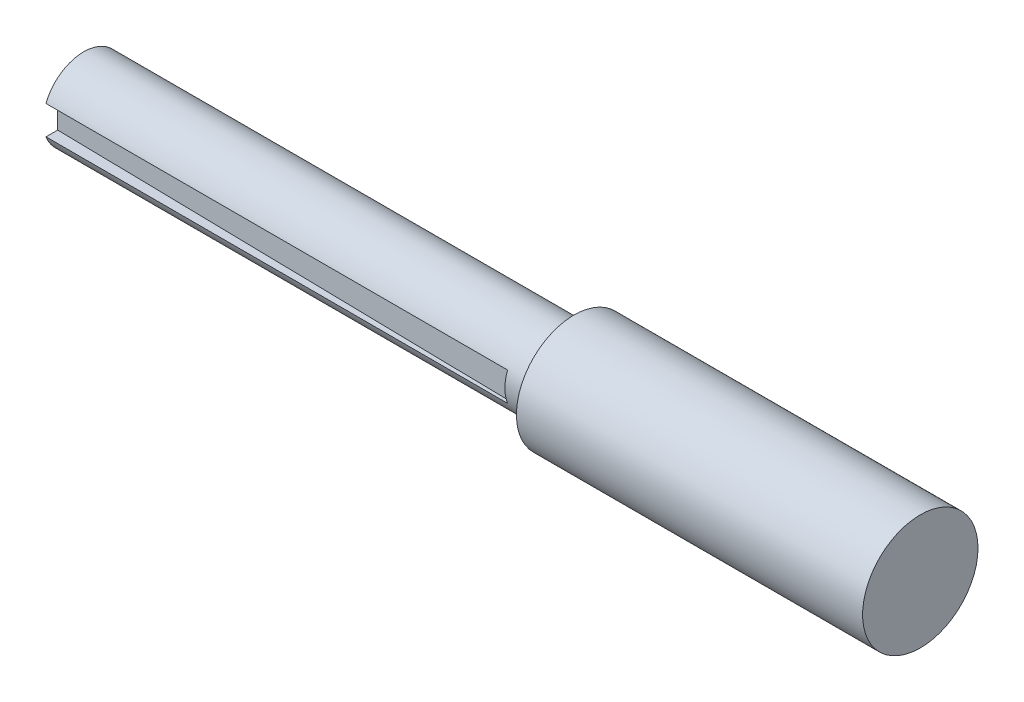
ISO-10303-21;
HEADER;
FILE_DESCRIPTION(('STEP AP214'),'2;1');
FILE_NAME('part.step','',(''),(''),'','','');
FILE_SCHEMA(('AUTOMOTIVE_DESIGN { 1 0 10303 214 1 1 1 1 }'));
ENDSEC;
DATA;
#1=APPLICATION_CONTEXT('core data for automotive mechanical design processes');
#2=APPLICATION_PROTOCOL_DEFINITION('international standard','automotive_design',2000,#1);
#3=PRODUCT_CONTEXT('',#1,'mechanical');
#4=PRODUCT('Part','Part','',(#3));
#5=PRODUCT_RELATED_PRODUCT_CATEGORY('part','',(#4));
#6=PRODUCT_DEFINITION_FORMATION('','',#4);
#7=PRODUCT_DEFINITION_CONTEXT('part definition',#1,'design');
#8=PRODUCT_DEFINITION('design','',#6,#7);
#9=PRODUCT_DEFINITION_SHAPE('','',#8);
#10=(LENGTH_UNIT() NAMED_UNIT(*) SI_UNIT(.MILLI.,.METRE.));
#11=(NAMED_UNIT(*) PLANE_ANGLE_UNIT() SI_UNIT($,.RADIAN.));
#12=(NAMED_UNIT(*) SI_UNIT($,.STERADIAN.) SOLID_ANGLE_UNIT());
#13=UNCERTAINTY_MEASURE_WITH_UNIT(LENGTH_MEASURE(1.E-05),#10,'distance_accuracy_value','');
#14=(GEOMETRIC_REPRESENTATION_CONTEXT(3) GLOBAL_UNCERTAINTY_ASSIGNED_CONTEXT((#13)) GLOBAL_UNIT_ASSIGNED_CONTEXT((#10,
#11,#12)) REPRESENTATION_CONTEXT('',''));
#15=CARTESIAN_POINT('',(0.,0.,0.));
#16=DIRECTION('',(0.,0.,1.));
#17=DIRECTION('',(1.,0.,0.));
#18=AXIS2_PLACEMENT_3D('',#15,#16,#17);
#19=CARTESIAN_POINT('',(-145.,0.,0.));
#20=DIRECTION('',(1.,0.,0.));
#21=DIRECTION('',(0.,0.,-1.));
#22=AXIS2_PLACEMENT_3D('',#19,#20,#21);
#23=CYLINDRICAL_SURFACE('',#22,10.);
#24=CARTESIAN_POINT('',(-60.,0.,0.));
#25=DIRECTION('',(1.,0.,0.));
#26=DIRECTION('',(0.,0.,-1.));
#27=AXIS2_PLACEMENT_3D('',#24,#25,#26);
#28=CIRCLE('',#27,10.);
#29=CARTESIAN_POINT('',(-60.,0.,-10.));
#30=VERTEX_POINT('',#29);
#31=EDGE_CURVE('E154',#30,#30,#28,.T.);
#32=ORIENTED_EDGE('',*,*,#31,.T.);
#33=EDGE_LOOP('',(#32));
#34=FACE_BOUND('',#33,.T.);
#35=CARTESIAN_POINT('',(0.,0.,0.));
#36=DIRECTION('',(1.,0.,0.));
#37=DIRECTION('',(0.,0.,-1.));
#38=AXIS2_PLACEMENT_3D('',#35,#36,#37);
#39=CIRCLE('',#38,10.);
#40=CARTESIAN_POINT('',(0.,0.,-10.));
#41=VERTEX_POINT('',#40);
#42=EDGE_CURVE('E166',#41,#41,#39,.T.);
#43=ORIENTED_EDGE('',*,*,#42,.F.);
#44=EDGE_LOOP('',(#43));
#45=FACE_BOUND('',#44,.T.);
#46=ADVANCED_FACE('F97',(#34,#45),#23,.T.);
#47=CARTESIAN_POINT('',(0.,0.,0.));
#48=DIRECTION('',(1.,0.,0.));
#49=DIRECTION('',(0.,0.,-1.));
#50=AXIS2_PLACEMENT_3D('',#47,#48,#49);
#51=PLANE('',#50);
#52=ORIENTED_EDGE('',*,*,#42,.T.);
#53=EDGE_LOOP('',(#52));
#54=FACE_BOUND('',#53,.T.);
#55=ADVANCED_FACE('F262',(#54),#51,.T.);
#56=CARTESIAN_POINT('',(-157.,0.,0.));
#57=DIRECTION('',(1.,0.,0.));
#58=DIRECTION('',(0.,0.,-1.));
#59=AXIS2_PLACEMENT_3D('',#56,#57,#58);
#60=CYLINDRICAL_SURFACE('',#59,7.);
#61=DIRECTION('',(1.,0.,0.));
#62=VECTOR('',#61,1.);
#63=CARTESIAN_POINT('',(-157.,2.5,6.53834841531101));
#64=LINE('',#63,#62);
#65=CARTESIAN_POINT('',(-65.,2.5,6.53834841531101));
#66=VERTEX_POINT('',#65);
#67=CARTESIAN_POINT('',(-145.,2.5,6.53834841531101));
#68=VERTEX_POINT('',#67);
#69=EDGE_CURVE('E147',#66,#68,#64,.F.);
#70=ORIENTED_EDGE('',*,*,#69,.F.);
#71=CARTESIAN_POINT('',(-65.,0.,0.));
#72=DIRECTION('',(-1.,0.,0.));
#73=DIRECTION('',(0.,0.,1.));
#74=AXIS2_PLACEMENT_3D('',#71,#72,#73);
#75=CIRCLE('',#74,7.);
#76=CARTESIAN_POINT('',(-65.,-2.5,6.53834841531101));
#77=VERTEX_POINT('',#76);
#78=EDGE_CURVE('E13',#66,#77,#75,.F.);
#79=ORIENTED_EDGE('',*,*,#78,.T.);
#80=DIRECTION('',(1.,0.,0.));
#81=VECTOR('',#80,1.);
#82=CARTESIAN_POINT('',(-157.,-2.5,6.53834841531101));
#83=LINE('',#82,#81);
#84=CARTESIAN_POINT('',(-145.,-2.5,6.53834841531101));
#85=VERTEX_POINT('',#84);
#86=EDGE_CURVE('E144',#85,#77,#83,.T.);
#87=ORIENTED_EDGE('',*,*,#86,.F.);
#88=CARTESIAN_POINT('',(-145.,0.,0.));
#89=DIRECTION('',(1.,0.,0.));
#90=DIRECTION('',(0.,0.,-1.));
#91=AXIS2_PLACEMENT_3D('',#88,#89,#90);
#92=CIRCLE('',#91,7.);
#93=EDGE_CURVE('E160',#85,#68,#92,.T.);
#94=ORIENTED_EDGE('',*,*,#93,.T.);
#95=EDGE_LOOP('',(#70,#79,#87,#94));
#96=FACE_BOUND('',#95,.T.);
#97=CARTESIAN_POINT('',(-61.,0.,0.));
#98=DIRECTION('',(1.,0.,0.));
#99=DIRECTION('',(0.,0.,-1.));
#100=AXIS2_PLACEMENT_3D('',#97,#98,#99);
#101=CIRCLE('',#100,7.);
#102=CARTESIAN_POINT('',(-61.,0.,-7.));
#103=VERTEX_POINT('',#102);
#104=EDGE_CURVE('E162',#103,#103,#101,.F.);
#105=ORIENTED_EDGE('',*,*,#104,.T.);
#106=EDGE_LOOP('',(#105));
#107=FACE_BOUND('',#106,.T.);
#108=ADVANCED_FACE('F163',(#96,#107),#60,.T.);
#109=CARTESIAN_POINT('',(-60.,0.,0.));
#110=DIRECTION('',(1.,0.,0.));
#111=DIRECTION('',(0.,0.,-1.));
#112=AXIS2_PLACEMENT_3D('',#109,#110,#111);
#113=PLANE('',#112);
#114=CARTESIAN_POINT('',(-60.,0.,0.));
#115=DIRECTION('',(1.,0.,0.));
#116=DIRECTION('',(0.,0.,-1.));
#117=AXIS2_PLACEMENT_3D('',#114,#115,#116);
#118=CIRCLE('',#117,8.);
#119=CARTESIAN_POINT('',(-60.,0.,-8.));
#120=VERTEX_POINT('',#119);
#121=EDGE_CURVE('E171',#120,#120,#118,.T.);
#122=ORIENTED_EDGE('',*,*,#121,.T.);
#123=EDGE_LOOP('',(#122));
#124=FACE_BOUND('',#123,.T.);
#125=ORIENTED_EDGE('',*,*,#31,.F.);
#126=EDGE_LOOP('',(#125));
#127=FACE_BOUND('',#126,.T.);
#128=ADVANCED_FACE('F254',(#124,#127),#113,.F.);
#129=CARTESIAN_POINT('',(-145.,0.,0.));
#130=DIRECTION('',(1.,0.,0.));
#131=DIRECTION('',(0.,0.,-1.));
#132=AXIS2_PLACEMENT_3D('',#129,#130,#131);
#133=PLANE('',#132);
#134=DIRECTION('',(0.,-1.,0.));
#135=VECTOR('',#134,1.);
#136=CARTESIAN_POINT('',(-145.,-2.5,4.50834841531101));
#137=LINE('',#136,#135);
#138=CARTESIAN_POINT('',(-145.,2.5,4.50834841531101));
#139=VERTEX_POINT('',#138);
#140=CARTESIAN_POINT('',(-145.,-2.5,4.50834841531101));
#141=VERTEX_POINT('',#140);
#142=EDGE_CURVE('E116',#139,#141,#137,.T.);
#143=ORIENTED_EDGE('',*,*,#142,.F.);
#144=DIRECTION('',(0.,0.,-1.));
#145=VECTOR('',#144,1.);
#146=CARTESIAN_POINT('',(-145.,2.5,0.));
#147=LINE('',#146,#145);
#148=EDGE_CURVE('E101',#139,#68,#147,.F.);
#149=ORIENTED_EDGE('',*,*,#148,.T.);
#150=ORIENTED_EDGE('',*,*,#93,.F.);
#151=DIRECTION('',(0.,0.,1.));
#152=VECTOR('',#151,1.);
#153=CARTESIAN_POINT('',(-145.,-2.5,9.50834841531101));
#154=LINE('',#153,#152);
#155=EDGE_CURVE('E297',#141,#85,#154,.T.);
#156=ORIENTED_EDGE('',*,*,#155,.F.);
#157=EDGE_LOOP('',(#143,#149,#150,#156));
#158=FACE_BOUND('',#157,.T.);
#159=ADVANCED_FACE('F158',(#158),#133,.F.);
#160=CARTESIAN_POINT('',(-61.,0.,0.));
#161=DIRECTION('',(1.,0.,0.));
#162=DIRECTION('',(0.,0.,-1.));
#163=AXIS2_PLACEMENT_3D('',#160,#161,#162);
#164=TOROIDAL_SURFACE('',#163,8.,1.);
#165=ORIENTED_EDGE('',*,*,#104,.F.);
#166=EDGE_LOOP('',(#165));
#167=FACE_BOUND('',#166,.T.);
#168=ORIENTED_EDGE('',*,*,#121,.F.);
#169=EDGE_LOOP('',(#168));
#170=FACE_BOUND('',#169,.T.);
#171=ADVANCED_FACE('F99',(#167,#170),#164,.F.);
#172=CARTESIAN_POINT('',(-65.,0.,0.));
#173=DIRECTION('',(-1.,0.,0.));
#174=DIRECTION('',(0.,0.,1.));
#175=AXIS2_PLACEMENT_3D('',#172,#173,#174);
#176=PLANE('',#175);
#177=DIRECTION('',(0.,0.,-1.));
#178=VECTOR('',#177,1.);
#179=CARTESIAN_POINT('',(-65.,2.5,9.50834841531101));
#180=LINE('',#179,#178);
#181=CARTESIAN_POINT('',(-65.,2.5,6.00834841531101));
#182=VERTEX_POINT('',#181);
#183=EDGE_CURVE('E149',#66,#182,#180,.T.);
#184=ORIENTED_EDGE('',*,*,#183,.T.);
#185=DIRECTION('',(0.,-1.,0.));
#186=VECTOR('',#185,1.);
#187=CARTESIAN_POINT('',(-65.,-2.5,6.00834841531101));
#188=LINE('',#187,#186);
#189=CARTESIAN_POINT('',(-65.,-2.5,6.00834841531101));
#190=VERTEX_POINT('',#189);
#191=EDGE_CURVE('E184',#182,#190,#188,.T.);
#192=ORIENTED_EDGE('',*,*,#191,.T.);
#193=DIRECTION('',(0.,0.,1.));
#194=VECTOR('',#193,1.);
#195=CARTESIAN_POINT('',(-65.,-2.5,9.50834841531101));
#196=LINE('',#195,#194);
#197=EDGE_CURVE('E134',#190,#77,#196,.T.);
#198=ORIENTED_EDGE('',*,*,#197,.T.);
#199=ORIENTED_EDGE('',*,*,#78,.F.);
#200=EDGE_LOOP('',(#184,#192,#198,#199));
#201=FACE_BOUND('',#200,.T.);
#202=ADVANCED_FACE('F202',(#201),#176,.T.);
#203=CARTESIAN_POINT('',(-145.,2.5,4.50834841531101));
#204=DIRECTION('',(0.,1.,0.));
#205=DIRECTION('',(0.,0.,1.));
#206=AXIS2_PLACEMENT_3D('',#203,#204,#205);
#207=PLANE('',#206);
#208=ORIENTED_EDGE('',*,*,#69,.T.);
#209=ORIENTED_EDGE('',*,*,#148,.F.);
#210=CARTESIAN_POINT('',(-145.,2.5,4.50834841531101));
#211=CARTESIAN_POINT('',(-118.333333333333,2.5,5.00834841531101));
#212=CARTESIAN_POINT('',(-91.6666666666666,2.5,5.50834841531101));
#213=CARTESIAN_POINT('',(-65.,2.5,6.00834841531101));
#214=B_SPLINE_CURVE_WITH_KNOTS('',3,(#210,#211,#212,#213),.UNSPECIFIED.,.F.,.F.,(4,4),(0.,1.),.UNSPECIFIED.);
#215=EDGE_CURVE('E293',#139,#182,#214,.T.);
#216=ORIENTED_EDGE('',*,*,#215,.T.);
#217=ORIENTED_EDGE('',*,*,#183,.F.);
#218=EDGE_LOOP('',(#208,#209,#216,#217));
#219=FACE_BOUND('',#218,.T.);
#220=ADVANCED_FACE('F148',(#219),#207,.F.);
#221=CARTESIAN_POINT('',(-145.,-2.5,4.50834841531101));
#222=DIRECTION('',(0.0187467049703437,0.,-0.999824265084997));
#223=DIRECTION('',(0.,1.,0.));
#224=AXIS2_PLACEMENT_3D('',#221,#222,#223);
#225=PLANE('',#224);
#226=ORIENTED_EDGE('',*,*,#142,.T.);
#227=CARTESIAN_POINT('',(-145.,-2.5,4.50834841531101));
#228=CARTESIAN_POINT('',(-118.333333333333,-2.5,5.00834841531101));
#229=CARTESIAN_POINT('',(-91.6666666666666,-2.5,5.50834841531101));
#230=CARTESIAN_POINT('',(-65.,-2.5,6.00834841531101));
#231=B_SPLINE_CURVE_WITH_KNOTS('',3,(#227,#228,#229,#230),.UNSPECIFIED.,.F.,.F.,(4,4),(0.,1.),.UNSPECIFIED.);
#232=EDGE_CURVE('E295',#141,#190,#231,.T.);
#233=ORIENTED_EDGE('',*,*,#232,.T.);
#234=ORIENTED_EDGE('',*,*,#191,.F.);
#235=ORIENTED_EDGE('',*,*,#215,.F.);
#236=EDGE_LOOP('',(#226,#233,#234,#235));
#237=FACE_BOUND('',#236,.T.);
#238=ADVANCED_FACE('F277',(#237),#225,.F.);
#239=CARTESIAN_POINT('',(-145.,-2.5,9.50834841531101));
#240=DIRECTION('',(0.,-1.,0.));
#241=DIRECTION('',(0.,0.,-1.));
#242=AXIS2_PLACEMENT_3D('',#239,#240,#241);
#243=PLANE('',#242);
#244=ORIENTED_EDGE('',*,*,#86,.T.);
#245=ORIENTED_EDGE('',*,*,#197,.F.);
#246=ORIENTED_EDGE('',*,*,#232,.F.);
#247=ORIENTED_EDGE('',*,*,#155,.T.);
#248=EDGE_LOOP('',(#244,#245,#246,#247));
#249=FACE_BOUND('',#248,.T.);
#250=ADVANCED_FACE('F274',(#249),#243,.F.);
#251=CLOSED_SHELL('',(#46,#55,#108,#128,#159,#171,#202,#220,#238,#250));
#252=MANIFOLD_SOLID_BREP('B2',#251);
#253=ADVANCED_BREP_SHAPE_REPRESENTATION('',(#18,#252),#14);
#254=SHAPE_DEFINITION_REPRESENTATION(#9,#253);
ENDSEC;
END-ISO-10303-21;
